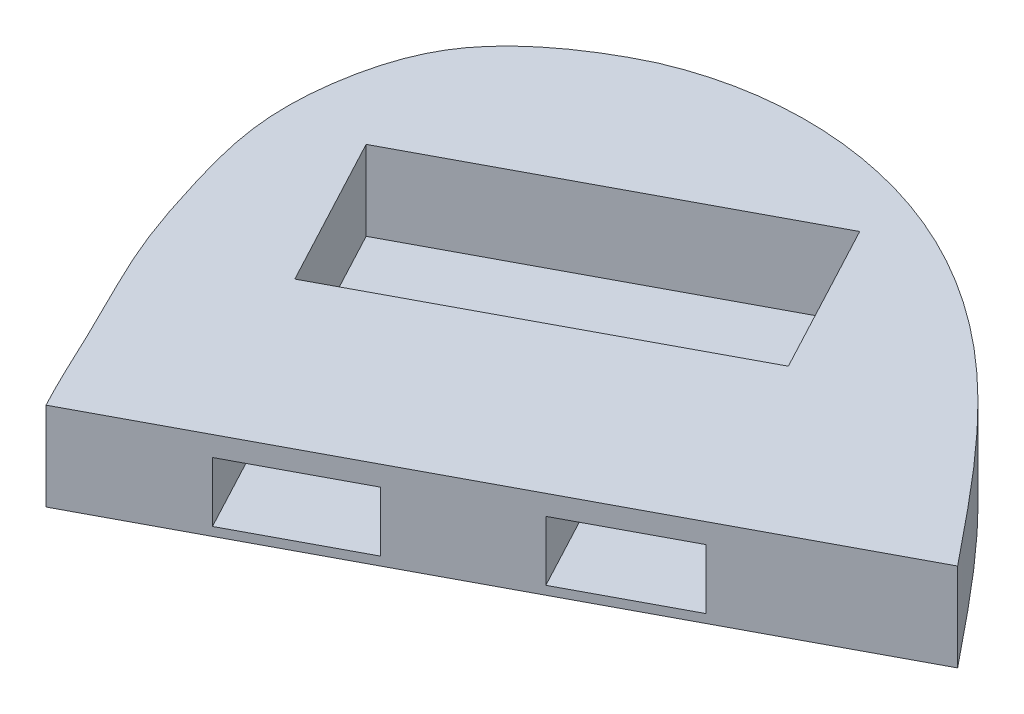
ISO-10303-21;
HEADER;
FILE_DESCRIPTION(('STEP AP214'),'2;1');
FILE_NAME('part.step','',(''),(''),'','','');
FILE_SCHEMA(('AUTOMOTIVE_DESIGN { 1 0 10303 214 1 1 1 1 }'));
ENDSEC;
DATA;
#1=APPLICATION_CONTEXT('core data for automotive mechanical design processes');
#2=APPLICATION_PROTOCOL_DEFINITION('international standard','automotive_design',2000,#1);
#3=PRODUCT_CONTEXT('',#1,'mechanical');
#4=PRODUCT('Part','Part','',(#3));
#5=PRODUCT_RELATED_PRODUCT_CATEGORY('part','',(#4));
#6=PRODUCT_DEFINITION_FORMATION('','',#4);
#7=PRODUCT_DEFINITION_CONTEXT('part definition',#1,'design');
#8=PRODUCT_DEFINITION('design','',#6,#7);
#9=PRODUCT_DEFINITION_SHAPE('','',#8);
#10=(LENGTH_UNIT() NAMED_UNIT(*) SI_UNIT(.MILLI.,.METRE.));
#11=(NAMED_UNIT(*) PLANE_ANGLE_UNIT() SI_UNIT($,.RADIAN.));
#12=(NAMED_UNIT(*) SI_UNIT($,.STERADIAN.) SOLID_ANGLE_UNIT());
#13=UNCERTAINTY_MEASURE_WITH_UNIT(LENGTH_MEASURE(1.E-05),#10,'distance_accuracy_value','');
#14=(GEOMETRIC_REPRESENTATION_CONTEXT(3) GLOBAL_UNCERTAINTY_ASSIGNED_CONTEXT((#13)) GLOBAL_UNIT_ASSIGNED_CONTEXT((#10,
#11,#12)) REPRESENTATION_CONTEXT('',''));
#15=CARTESIAN_POINT('',(0.,0.,0.));
#16=DIRECTION('',(0.,0.,1.));
#17=DIRECTION('',(1.,0.,0.));
#18=AXIS2_PLACEMENT_3D('',#15,#16,#17);
#19=CARTESIAN_POINT('',(161.96,-1.3,136.1));
#20=CARTESIAN_POINT('',(172.431616467289,-1.3,132.92366062549));
#21=CARTESIAN_POINT('',(186.600337708084,-1.3,121.715263251537));
#22=CARTESIAN_POINT('',(189.39912013615,-1.3,101.609128057562));
#23=CARTESIAN_POINT('',(188.081273673558,-1.3,88.7381643125429));
#24=CARTESIAN_POINT('',(184.88946775456,-1.3,75.87612702777));
#25=CARTESIAN_POINT('',(179.456656007756,-1.3,63.2892862222078));
#26=CARTESIAN_POINT('',(173.041480099588,-1.3,50.8418749109873));
#27=CARTESIAN_POINT('',(166.799810929657,-1.3,38.2708218209586));
#28=CARTESIAN_POINT('',(161.603657949585,-1.3,25.3960778456965));
#29=CARTESIAN_POINT('',(156.248349303257,-1.3,12.7940604652609));
#30=CARTESIAN_POINT('',(151.450238348983,-1.3,0.0963512466594107));
#31=CARTESIAN_POINT('',(147.52678179433,-1.3,-12.9146643821365));
#32=CARTESIAN_POINT('',(141.825873335453,-1.3,-25.2640208799849));
#33=CARTESIAN_POINT('',(137.370197820183,-1.3,-38.2208791740462));
#34=CARTESIAN_POINT('',(131.875071866326,-1.3,-50.7949729016655));
#35=CARTESIAN_POINT('',(126.706198444075,-1.3,-64.3167835663084));
#36=CARTESIAN_POINT('',(117.282300149337,-1.3,-76.4515785710107));
#37=CARTESIAN_POINT('',(103.420435283994,-1.3,-93.7594552532727));
#38=CARTESIAN_POINT('',(86.8423926637906,-1.3,-113.310643183046));
#39=CARTESIAN_POINT('',(58.2004956516375,-1.3,-131.153143926562));
#40=CARTESIAN_POINT('',(35.3862610002115,-1.3,-132.287626365866));
#41=CARTESIAN_POINT('',(23.0499999999999,-1.3,-127.));
#42=B_SPLINE_CURVE_WITH_KNOTS('',3,(#19,#20,#21,#22,#23,#24,#25,#26,#27,#28,#29,#30,#31,#32,#33,
#34,#35,#36,#37,#38,#39,#40,#41),.UNSPECIFIED.,.F.,.F.,(4,1,1,1,1,1,1,1,1,1,1,1,1,1,1,1,1,1,1,1,
4),(0.,0.095093521970901,0.131398847676974,0.167295759000827,0.204174645914071,
0.242856644234697,0.282808561262435,0.322537215964124,0.361360106680141,0.400063588703523,
0.438231587369451,0.476003008797342,0.514706490820723,0.552943743519897,0.591625741840523,
0.630784900558882,0.674461237731413,0.720301596717692,0.818758385380868,0.889157941201047,1.),.UNSPECIFIED.);
#43=DIRECTION('',(0.,1.,0.));
#44=VECTOR('',#43,1.);
#45=SURFACE_OF_LINEAR_EXTRUSION('',#42,#44);
#46=DIRECTION('',(0.,-1.,0.));
#47=VECTOR('',#46,1.);
#48=CARTESIAN_POINT('',(111.276939854169,12.,-83.9283732031464));
#49=LINE('',#48,#47);
#50=CARTESIAN_POINT('',(111.276939854169,12.,-83.9283732031464));
#51=VERTEX_POINT('',#50);
#52=CARTESIAN_POINT('',(111.276939854169,-1.3,-83.9283732031464));
#53=VERTEX_POINT('',#52);
#54=EDGE_CURVE('E257',#51,#53,#49,.T.);
#55=ORIENTED_EDGE('',*,*,#54,.T.);
#56=CARTESIAN_POINT('',(23.0499999999999,-1.3,-127.));
#57=VERTEX_POINT('',#56);
#58=EDGE_CURVE('E283',#53,#57,#42,.T.);
#59=ORIENTED_EDGE('',*,*,#58,.T.);
#60=DIRECTION('',(0.,1.,0.));
#61=VECTOR('',#60,1.);
#62=CARTESIAN_POINT('',(23.0499999999999,-1.3,-127.));
#63=LINE('',#62,#61);
#64=CARTESIAN_POINT('',(23.0499999999999,12.,-127.));
#65=VERTEX_POINT('',#64);
#66=EDGE_CURVE('E11',#57,#65,#63,.T.);
#67=ORIENTED_EDGE('',*,*,#66,.T.);
#68=CARTESIAN_POINT('',(161.96,12.,136.1));
#69=CARTESIAN_POINT('',(172.431616467289,12.,132.92366062549));
#70=CARTESIAN_POINT('',(186.600337708084,12.,121.715263251537));
#71=CARTESIAN_POINT('',(189.39912013615,12.,101.609128057562));
#72=CARTESIAN_POINT('',(188.081273673558,12.,88.7381643125429));
#73=CARTESIAN_POINT('',(184.88946775456,12.,75.87612702777));
#74=CARTESIAN_POINT('',(179.456656007756,12.,63.2892862222078));
#75=CARTESIAN_POINT('',(173.041480099588,12.,50.8418749109873));
#76=CARTESIAN_POINT('',(166.799810929657,12.,38.2708218209586));
#77=CARTESIAN_POINT('',(161.603657949585,12.,25.3960778456965));
#78=CARTESIAN_POINT('',(156.248349303257,12.,12.7940604652609));
#79=CARTESIAN_POINT('',(151.450238348983,12.,0.0963512466594107));
#80=CARTESIAN_POINT('',(147.52678179433,12.,-12.9146643821365));
#81=CARTESIAN_POINT('',(141.825873335453,12.,-25.2640208799849));
#82=CARTESIAN_POINT('',(137.370197820183,12.,-38.2208791740462));
#83=CARTESIAN_POINT('',(131.875071866326,12.,-50.7949729016655));
#84=CARTESIAN_POINT('',(126.706198444075,12.,-64.3167835663084));
#85=CARTESIAN_POINT('',(117.282300149337,12.,-76.4515785710107));
#86=CARTESIAN_POINT('',(103.420435283994,12.,-93.7594552532727));
#87=CARTESIAN_POINT('',(86.8423926637906,12.,-113.310643183046));
#88=CARTESIAN_POINT('',(58.2004956516375,12.,-131.153143926562));
#89=CARTESIAN_POINT('',(35.3862610002115,12.,-132.287626365866));
#90=CARTESIAN_POINT('',(23.0499999999999,12.,-127.));
#91=B_SPLINE_CURVE_WITH_KNOTS('',3,(#68,#69,#70,#71,#72,#73,#74,#75,#76,#77,#78,#79,#80,#81,#82,
#83,#84,#85,#86,#87,#88,#89,#90),.UNSPECIFIED.,.F.,.F.,(4,1,1,1,1,1,1,1,1,1,1,1,1,1,1,1,1,1,1,1,
4),(0.,0.095093521970901,0.131398847676974,0.167295759000827,0.204174645914071,
0.242856644234697,0.282808561262435,0.322537215964124,0.361360106680141,0.400063588703523,
0.438231587369451,0.476003008797342,0.514706490820723,0.552943743519897,0.591625741840523,
0.630784900558882,0.674461237731413,0.720301596717692,0.818758385380868,0.889157941201047,1.),.UNSPECIFIED.);
#92=EDGE_CURVE('E232',#51,#65,#91,.T.);
#93=ORIENTED_EDGE('',*,*,#92,.F.);
#94=EDGE_LOOP('',(#55,#59,#67,#93));
#95=FACE_BOUND('',#94,.T.);
#96=ADVANCED_FACE('F41',(#95),#45,.T.);
#97=CARTESIAN_POINT('',(23.0499999999999,-1.3,-127.));
#98=CARTESIAN_POINT('',(22.9431635762633,-1.3,-126.902857828468));
#99=CARTESIAN_POINT('',(6.62086757120866,-1.3,-120.021081895016));
#100=CARTESIAN_POINT('',(0.93108624500881,-1.3,-101.48897046444));
#101=CARTESIAN_POINT('',(0.324008085861042,-1.3,-88.7192103159989));
#102=CARTESIAN_POINT('',(3.82594963673352,-1.3,-76.0058926896927));
#103=CARTESIAN_POINT('',(8.10752215909319,-1.3,-63.1658116784858));
#104=CARTESIAN_POINT('',(14.622542207347,-1.3,-50.8573194440418));
#105=CARTESIAN_POINT('',(20.4776217353281,-1.3,-37.8047033475267));
#106=CARTESIAN_POINT('',(28.0273865457471,-1.3,-24.819252914753));
#107=CARTESIAN_POINT('',(38.054220669438,-1.3,-12.1740803632335));
#108=CARTESIAN_POINT('',(50.0870485617876,-1.3,0.413905352796121));
#109=CARTESIAN_POINT('',(63.5158751206686,-1.3,12.7149262026637));
#110=CARTESIAN_POINT('',(76.9950020252157,-1.3,24.6371097229556));
#111=CARTESIAN_POINT('',(87.7537254124703,-1.3,37.6768141146385));
#112=CARTESIAN_POINT('',(96.951336769717,-1.3,50.0663809997177));
#113=CARTESIAN_POINT('',(102.49064318237,-1.3,63.337711531044));
#114=CARTESIAN_POINT('',(106.915198332159,-1.3,76.2856654625522));
#115=CARTESIAN_POINT('',(112.188407389899,-1.3,88.8151457373196));
#116=CARTESIAN_POINT('',(116.555805717589,-1.3,101.829881851784));
#117=CARTESIAN_POINT('',(122.760488067814,-1.3,115.656378347754));
#118=CARTESIAN_POINT('',(136.343257750094,-1.3,130.188055829177));
#119=CARTESIAN_POINT('',(151.998790453451,-1.3,139.029236194937));
#120=CARTESIAN_POINT('',(161.96,-1.3,136.1));
#121=B_SPLINE_CURVE_WITH_KNOTS('',3,(#97,#98,#99,#100,#101,#102,#103,#104,#105,#106,#107,#108,
#109,#110,#111,#112,#113,#114,#115,#116,#117,#118,#119,#120),.UNSPECIFIED.,.F.,.F.,(4,1,1,1,1,1,
1,1,1,1,1,1,1,1,1,1,1,1,1,1,1,4),(0.,0.0909453488821513,0.12664197023849,0.163655192886483,
0.201591738389516,0.240816763902877,0.281850131450043,0.322917616936431,0.365825557459317,
0.412648122136861,0.463551178747464,0.51780414134582,0.571801954990976,0.620389185691441,
0.6653351168887,0.705885891764608,0.745281612490757,0.785018619503263,0.824424381322106,
0.865568121146972,0.915423296508897,1.),.UNSPECIFIED.);
#122=DIRECTION('',(0.,1.,0.));
#123=VECTOR('',#122,1.);
#124=SURFACE_OF_LINEAR_EXTRUSION('',#121,#123);
#125=CARTESIAN_POINT('',(21.5820295756437,-1.3,-36.2367434360244));
#126=VERTEX_POINT('',#125);
#127=EDGE_CURVE('E51',#57,#126,#121,.T.);
#128=ORIENTED_EDGE('',*,*,#127,.T.);
#129=DIRECTION('',(0.,-1.,0.));
#130=VECTOR('',#129,1.);
#131=CARTESIAN_POINT('',(21.5820295756437,12.,-36.2367434360244));
#132=LINE('',#131,#130);
#133=CARTESIAN_POINT('',(21.5820295756437,12.,-36.2367434360244));
#134=VERTEX_POINT('',#133);
#135=EDGE_CURVE('E273',#134,#126,#132,.T.);
#136=ORIENTED_EDGE('',*,*,#135,.F.);
#137=CARTESIAN_POINT('',(23.0499999999999,12.,-127.));
#138=CARTESIAN_POINT('',(22.9431635762633,12.,-126.902857828468));
#139=CARTESIAN_POINT('',(6.62086757120866,12.,-120.021081895016));
#140=CARTESIAN_POINT('',(0.93108624500881,12.,-101.48897046444));
#141=CARTESIAN_POINT('',(0.324008085861042,12.,-88.7192103159989));
#142=CARTESIAN_POINT('',(3.82594963673352,12.,-76.0058926896927));
#143=CARTESIAN_POINT('',(8.10752215909319,12.,-63.1658116784858));
#144=CARTESIAN_POINT('',(14.622542207347,12.,-50.8573194440418));
#145=CARTESIAN_POINT('',(20.4776217353281,12.,-37.8047033475267));
#146=CARTESIAN_POINT('',(28.0273865457471,12.,-24.819252914753));
#147=CARTESIAN_POINT('',(38.054220669438,12.,-12.1740803632335));
#148=CARTESIAN_POINT('',(50.0870485617876,12.,0.413905352796121));
#149=CARTESIAN_POINT('',(63.5158751206686,12.,12.7149262026637));
#150=CARTESIAN_POINT('',(76.9950020252157,12.,24.6371097229556));
#151=CARTESIAN_POINT('',(87.7537254124703,12.,37.6768141146385));
#152=CARTESIAN_POINT('',(96.951336769717,12.,50.0663809997177));
#153=CARTESIAN_POINT('',(102.49064318237,12.,63.337711531044));
#154=CARTESIAN_POINT('',(106.915198332159,12.,76.2856654625522));
#155=CARTESIAN_POINT('',(112.188407389899,12.,88.8151457373196));
#156=CARTESIAN_POINT('',(116.555805717589,12.,101.829881851784));
#157=CARTESIAN_POINT('',(122.760488067814,12.,115.656378347754));
#158=CARTESIAN_POINT('',(136.343257750094,12.,130.188055829177));
#159=CARTESIAN_POINT('',(151.998790453451,12.,139.029236194937));
#160=CARTESIAN_POINT('',(161.96,12.,136.1));
#161=B_SPLINE_CURVE_WITH_KNOTS('',3,(#137,#138,#139,#140,#141,#142,#143,#144,#145,#146,#147,
#148,#149,#150,#151,#152,#153,#154,#155,#156,#157,#158,#159,#160),.UNSPECIFIED.,.F.,.F.,(4,1,1,
1,1,1,1,1,1,1,1,1,1,1,1,1,1,1,1,1,1,4),(0.,0.0909453488821513,0.12664197023849,
0.163655192886483,0.201591738389516,0.240816763902877,0.281850131450043,0.322917616936431,
0.365825557459317,0.412648122136861,0.463551178747464,0.51780414134582,0.571801954990976,
0.620389185691441,0.6653351168887,0.705885891764608,0.745281612490757,0.785018619503263,
0.824424381322106,0.865568121146972,0.915423296508897,1.),.UNSPECIFIED.);
#162=EDGE_CURVE('E219',#65,#134,#161,.T.);
#163=ORIENTED_EDGE('',*,*,#162,.F.);
#164=ORIENTED_EDGE('',*,*,#66,.F.);
#165=EDGE_LOOP('',(#128,#136,#163,#164));
#166=FACE_BOUND('',#165,.T.);
#167=ADVANCED_FACE('F317',(#166),#124,.T.);
#168=CARTESIAN_POINT('',(144.030495131598,-1.3,-20.5786991562864));
#169=DIRECTION('',(0.,-1.,0.));
#170=DIRECTION('',(0.,0.,-1.));
#171=AXIS2_PLACEMENT_3D('',#168,#169,#170);
#172=PLANE('',#171);
#173=DIRECTION('',(-0.882947592858926,0.,0.469471562785893));
#174=VECTOR('',#173,1.);
#175=CARTESIAN_POINT('',(111.276939854169,-1.3,-83.9283732031464));
#176=LINE('',#175,#174);
#177=EDGE_CURVE('E149',#53,#126,#176,.T.);
#178=ORIENTED_EDGE('',*,*,#177,.T.);
#179=ORIENTED_EDGE('',*,*,#127,.F.);
#180=ORIENTED_EDGE('',*,*,#58,.F.);
#181=EDGE_LOOP('',(#178,#179,#180));
#182=FACE_BOUND('',#181,.T.);
#183=ADVANCED_FACE('F315',(#182),#172,.T.);
#184=CARTESIAN_POINT('',(-36.5544625265365,12.,-68.7489451001683));
#185=DIRECTION('',(0.469471562785889,0.,0.882947592858928));
#186=DIRECTION('',(0.882947592858928,0.,-0.46947156278589));
#187=AXIS2_PLACEMENT_3D('',#184,#185,#186);
#188=PLANE('',#187);
#189=DIRECTION('',(-0.882947592858928,0.,0.46947156278589));
#190=VECTOR('',#189,1.);
#191=CARTESIAN_POINT('',(-36.5544625265365,0.,-68.7489451001683));
#192=LINE('',#191,#190);
#193=CARTESIAN_POINT('',(60.233534311796,0.,-120.212035890731));
#194=VERTEX_POINT('',#193);
#195=CARTESIAN_POINT('',(11.671416704555,0.,-94.3910999375069));
#196=VERTEX_POINT('',#195);
#197=EDGE_CURVE('E216',#194,#196,#192,.T.);
#198=ORIENTED_EDGE('',*,*,#197,.F.);
#199=DIRECTION('',(0.,-1.,0.));
#200=VECTOR('',#199,1.);
#201=CARTESIAN_POINT('',(60.233534311796,12.,-120.212035890731));
#202=LINE('',#201,#200);
#203=CARTESIAN_POINT('',(60.233534311796,12.,-120.212035890731));
#204=VERTEX_POINT('',#203);
#205=EDGE_CURVE('E280',#204,#194,#202,.T.);
#206=ORIENTED_EDGE('',*,*,#205,.F.);
#207=DIRECTION('',(-0.882947592858928,0.,0.46947156278589));
#208=VECTOR('',#207,1.);
#209=CARTESIAN_POINT('',(-36.5544625265365,12.,-68.7489451001683));
#210=LINE('',#209,#208);
#211=CARTESIAN_POINT('',(11.671416704555,12.,-94.3910999375069));
#212=VERTEX_POINT('',#211);
#213=EDGE_CURVE('E238',#204,#212,#210,.T.);
#214=ORIENTED_EDGE('',*,*,#213,.T.);
#215=DIRECTION('',(0.,-1.,0.));
#216=VECTOR('',#215,1.);
#217=CARTESIAN_POINT('',(11.671416704555,12.,-94.3910999375069));
#218=LINE('',#217,#216);
#219=EDGE_CURVE('E269',#212,#196,#218,.T.);
#220=ORIENTED_EDGE('',*,*,#219,.T.);
#221=EDGE_LOOP('',(#198,#206,#214,#220));
#222=FACE_BOUND('',#221,.T.);
#223=ADVANCED_FACE('F336',(#222),#188,.T.);
#224=CARTESIAN_POINT('',(96.7879968383325,12.,-51.4630907905626));
#225=DIRECTION('',(-0.882947592858928,0.,0.46947156278589));
#226=DIRECTION('',(0.46947156278589,0.,0.882947592858928));
#227=AXIS2_PLACEMENT_3D('',#224,#225,#226);
#228=PLANE('',#227);
#229=DIRECTION('',(-0.46947156278589,0.,-0.882947592858928));
#230=VECTOR('',#229,1.);
#231=CARTESIAN_POINT('',(96.7879968383325,0.,-51.4630907905626));
#232=LINE('',#231,#230);
#233=CARTESIAN_POINT('',(86.5239418278059,0.,-70.7669706906301));
#234=VERTEX_POINT('',#233);
#235=EDGE_CURVE('E261',#234,#194,#232,.T.);
#236=ORIENTED_EDGE('',*,*,#235,.F.);
#237=DIRECTION('',(0.,1.,0.));
#238=VECTOR('',#237,1.);
#239=CARTESIAN_POINT('',(86.5239418278059,0.,-70.7669706906301));
#240=LINE('',#239,#238);
#241=CARTESIAN_POINT('',(86.5239418278059,9.,-70.76697069063));
#242=VERTEX_POINT('',#241);
#243=EDGE_CURVE('E67',#234,#242,#240,.T.);
#244=ORIENTED_EDGE('',*,*,#243,.T.);
#245=DIRECTION('',(0.46947156278588,0.,0.882947592858933));
#246=VECTOR('',#245,1.);
#247=CARTESIAN_POINT('',(42.0230522540179,9.,-154.46097144351));
#248=LINE('',#247,#246);
#249=CARTESIAN_POINT('',(72.4397949442291,9.,-97.2553984763987));
#250=VERTEX_POINT('',#249);
#251=EDGE_CURVE('E173',#250,#242,#248,.T.);
#252=ORIENTED_EDGE('',*,*,#251,.F.);
#253=DIRECTION('',(0.,-1.,0.));
#254=VECTOR('',#253,1.);
#255=CARTESIAN_POINT('',(72.4397949442291,12.,-97.2553984763987));
#256=LINE('',#255,#254);
#257=CARTESIAN_POINT('',(72.4397949442291,12.,-97.2553984763987));
#258=VERTEX_POINT('',#257);
#259=EDGE_CURVE('E276',#258,#250,#256,.T.);
#260=ORIENTED_EDGE('',*,*,#259,.F.);
#261=DIRECTION('',(-0.46947156278589,0.,-0.882947592858928));
#262=VECTOR('',#261,1.);
#263=CARTESIAN_POINT('',(96.7879968383325,12.,-51.4630907905626));
#264=LINE('',#263,#262);
#265=EDGE_CURVE('E245',#258,#204,#264,.T.);
#266=ORIENTED_EDGE('',*,*,#265,.T.);
#267=ORIENTED_EDGE('',*,*,#205,.T.);
#268=EDGE_LOOP('',(#236,#244,#252,#260,#266,#267));
#269=FACE_BOUND('',#268,.T.);
#270=ADVANCED_FACE('F332',(#269),#228,.T.);
#271=CARTESIAN_POINT('',(-24.3482018941034,12.,-45.7923076858362));
#272=DIRECTION('',(-0.469471562785889,0.,-0.882947592858928));
#273=DIRECTION('',(-0.882947592858928,0.,0.469471562785889));
#274=AXIS2_PLACEMENT_3D('',#271,#272,#273);
#275=PLANE('',#274);
#276=DIRECTION('',(-0.882947592858928,0.,0.469471562785889));
#277=VECTOR('',#276,1.);
#278=CARTESIAN_POINT('',(-24.3482018941023,9.,-45.7923076858368));
#279=LINE('',#278,#277);
#280=CARTESIAN_POINT('',(40.3954124725844,9.,-80.2170980844576));
#281=VERTEX_POINT('',#280);
#282=CARTESIAN_POINT('',(23.8776773369881,9.,-71.4344625231748));
#283=VERTEX_POINT('',#282);
#284=EDGE_CURVE('E138',#281,#283,#279,.T.);
#285=ORIENTED_EDGE('',*,*,#284,.T.);
#286=DIRECTION('',(0.,-1.,0.));
#287=VECTOR('',#286,1.);
#288=CARTESIAN_POINT('',(23.8776773369881,12.,-71.4344625231748));
#289=LINE('',#288,#287);
#290=CARTESIAN_POINT('',(23.8776773369881,12.,-71.4344625231748));
#291=VERTEX_POINT('',#290);
#292=EDGE_CURVE('E272',#291,#283,#289,.T.);
#293=ORIENTED_EDGE('',*,*,#292,.F.);
#294=DIRECTION('',(0.882947592858928,0.,-0.469471562785889));
#295=VECTOR('',#294,1.);
#296=CARTESIAN_POINT('',(-24.3482018941034,12.,-45.7923076858362));
#297=LINE('',#296,#295);
#298=EDGE_CURVE('E249',#291,#258,#297,.T.);
#299=ORIENTED_EDGE('',*,*,#298,.T.);
#300=ORIENTED_EDGE('',*,*,#259,.T.);
#301=DIRECTION('',(0.882947592858928,0.,-0.469471562785889));
#302=VECTOR('',#301,1.);
#303=CARTESIAN_POINT('',(-24.3482018941023,9.,-45.7923076858368));
#304=LINE('',#303,#302);
#305=CARTESIAN_POINT('',(56.678241156403,9.,-88.8748316697719));
#306=VERTEX_POINT('',#305);
#307=EDGE_CURVE('E188',#306,#250,#304,.T.);
#308=ORIENTED_EDGE('',*,*,#307,.F.);
#309=DIRECTION('',(0.,-1.,0.));
#310=VECTOR('',#309,1.);
#311=CARTESIAN_POINT('',(56.678241156403,0.,-88.8748316697719));
#312=LINE('',#311,#310);
#313=CARTESIAN_POINT('',(56.678241156403,0.,-88.8748316697719));
#314=VERTEX_POINT('',#313);
#315=EDGE_CURVE('E167',#306,#314,#312,.T.);
#316=ORIENTED_EDGE('',*,*,#315,.T.);
#317=DIRECTION('',(0.882947592858928,0.,-0.469471562785889));
#318=VECTOR('',#317,1.);
#319=CARTESIAN_POINT('',(-24.3482018941034,0.,-45.7923076858362));
#320=LINE('',#319,#318);
#321=CARTESIAN_POINT('',(40.3954124725844,0.,-80.2170980844576));
#322=VERTEX_POINT('',#321);
#323=EDGE_CURVE('E165',#322,#314,#320,.T.);
#324=ORIENTED_EDGE('',*,*,#323,.F.);
#325=DIRECTION('',(0.,-1.,0.));
#326=VECTOR('',#325,1.);
#327=CARTESIAN_POINT('',(40.3954124725844,0.,-80.2170980844575));
#328=LINE('',#327,#326);
#329=EDGE_CURVE('E155',#281,#322,#328,.T.);
#330=ORIENTED_EDGE('',*,*,#329,.F.);
#331=EDGE_LOOP('',(#285,#293,#299,#300,#308,#316,#324,#330));
#332=FACE_BOUND('',#331,.T.);
#333=ADVANCED_FACE('F162',(#332),#275,.T.);
#334=CARTESIAN_POINT('',(-10.2640550105267,12.,-19.3038799000688));
#335=DIRECTION('',(-0.469471562785879,0.,-0.882947592858933));
#336=DIRECTION('',(-0.882947592858933,0.,0.46947156278588));
#337=AXIS2_PLACEMENT_3D('',#334,#335,#336);
#338=PLANE('',#337);
#339=DIRECTION('',(0.,-1.,0.));
#340=VECTOR('',#339,1.);
#341=CARTESIAN_POINT('',(37.9618242205645,0.,-44.9460347374067));
#342=LINE('',#341,#340);
#343=CARTESIAN_POINT('',(37.9618242205645,9.,-44.9460347374067));
#344=VERTEX_POINT('',#343);
#345=CARTESIAN_POINT('',(37.9618242205645,0.,-44.9460347374067));
#346=VERTEX_POINT('',#345);
#347=EDGE_CURVE('E178',#344,#346,#342,.T.);
#348=ORIENTED_EDGE('',*,*,#347,.F.);
#349=DIRECTION('',(-0.882947592858933,0.,0.46947156278588));
#350=VECTOR('',#349,1.);
#351=CARTESIAN_POINT('',(-10.2640550105267,9.,-19.3038799000688));
#352=LINE('',#351,#350);
#353=CARTESIAN_POINT('',(54.479559356161,9.,-53.7286702986892));
#354=VERTEX_POINT('',#353);
#355=EDGE_CURVE('E171',#354,#344,#352,.T.);
#356=ORIENTED_EDGE('',*,*,#355,.F.);
#357=DIRECTION('',(0.,-1.,0.));
#358=VECTOR('',#357,1.);
#359=CARTESIAN_POINT('',(54.479559356161,0.,-53.7286702986892));
#360=LINE('',#359,#358);
#361=CARTESIAN_POINT('',(54.479559356161,0.,-53.7286702986892));
#362=VERTEX_POINT('',#361);
#363=EDGE_CURVE('E158',#354,#362,#360,.T.);
#364=ORIENTED_EDGE('',*,*,#363,.T.);
#365=DIRECTION('',(0.882947592858933,0.,-0.46947156278588));
#366=VECTOR('',#365,1.);
#367=CARTESIAN_POINT('',(-10.2640550105267,0.,-19.3038799000688));
#368=LINE('',#367,#366);
#369=EDGE_CURVE('E59',#346,#362,#368,.T.);
#370=ORIENTED_EDGE('',*,*,#369,.F.);
#371=EDGE_LOOP('',(#348,#356,#364,#370));
#372=FACE_BOUND('',#371,.T.);
#373=DIRECTION('',(0.882947592858933,0.,-0.46947156278588));
#374=VECTOR('',#373,1.);
#375=CARTESIAN_POINT('',(-10.2640550105267,0.,-19.3038799000688));
#376=LINE('',#375,#374);
#377=CARTESIAN_POINT('',(70.7623880399797,0.,-62.3864038840034));
#378=VERTEX_POINT('',#377);
#379=EDGE_CURVE('E199',#378,#234,#376,.T.);
#380=ORIENTED_EDGE('',*,*,#379,.F.);
#381=DIRECTION('',(0.,-1.,0.));
#382=VECTOR('',#381,1.);
#383=CARTESIAN_POINT('',(70.7623880399797,0.,-62.3864038840034));
#384=LINE('',#383,#382);
#385=CARTESIAN_POINT('',(70.7623880399797,9.,-62.3864038840034));
#386=VERTEX_POINT('',#385);
#387=EDGE_CURVE('E195',#386,#378,#384,.T.);
#388=ORIENTED_EDGE('',*,*,#387,.F.);
#389=DIRECTION('',(0.882947592858933,0.,-0.46947156278588));
#390=VECTOR('',#389,1.);
#391=CARTESIAN_POINT('',(-10.2640550105267,9.,-19.3038799000688));
#392=LINE('',#391,#390);
#393=EDGE_CURVE('E191',#386,#242,#392,.T.);
#394=ORIENTED_EDGE('',*,*,#393,.T.);
#395=ORIENTED_EDGE('',*,*,#243,.F.);
#396=EDGE_LOOP('',(#380,#388,#394,#395));
#397=FACE_BOUND('',#396,.T.);
#398=ORIENTED_EDGE('',*,*,#135,.T.);
#399=ORIENTED_EDGE('',*,*,#177,.F.);
#400=ORIENTED_EDGE('',*,*,#54,.F.);
#401=DIRECTION('',(0.882947592858933,0.,-0.46947156278588));
#402=VECTOR('',#401,1.);
#403=CARTESIAN_POINT('',(-10.2640550105267,12.,-19.3038799000688));
#404=LINE('',#403,#402);
#405=EDGE_CURVE('E225',#134,#51,#404,.T.);
#406=ORIENTED_EDGE('',*,*,#405,.F.);
#407=EDGE_LOOP('',(#398,#399,#400,#406));
#408=FACE_BOUND('',#407,.T.);
#409=ADVANCED_FACE('F308',(#372,#397,#408),#338,.F.);
#410=CARTESIAN_POINT('',(48.2258792310915,12.,-25.6421548373386));
#411=DIRECTION('',(0.882947592858928,0.,-0.469471562785889));
#412=DIRECTION('',(-0.469471562785889,0.,-0.882947592858928));
#413=AXIS2_PLACEMENT_3D('',#410,#411,#412);
#414=PLANE('',#413);
#415=DIRECTION('',(0.469471562785889,0.,0.882947592858928));
#416=VECTOR('',#415,1.);
#417=CARTESIAN_POINT('',(48.2258792310915,0.,-25.6421548373386));
#418=LINE('',#417,#416);
#419=EDGE_CURVE('E226',#196,#346,#418,.T.);
#420=ORIENTED_EDGE('',*,*,#419,.F.);
#421=ORIENTED_EDGE('',*,*,#219,.F.);
#422=DIRECTION('',(0.469471562785889,0.,0.882947592858928));
#423=VECTOR('',#422,1.);
#424=CARTESIAN_POINT('',(48.2258792310915,12.,-25.6421548373386));
#425=LINE('',#424,#423);
#426=EDGE_CURVE('E253',#212,#291,#425,.T.);
#427=ORIENTED_EDGE('',*,*,#426,.T.);
#428=ORIENTED_EDGE('',*,*,#292,.T.);
#429=DIRECTION('',(0.46947156278588,0.,0.882947592858933));
#430=VECTOR('',#429,1.);
#431=CARTESIAN_POINT('',(-6.53906535322345,9.,-128.640035490287));
#432=LINE('',#431,#430);
#433=EDGE_CURVE('E144',#283,#344,#432,.T.);
#434=ORIENTED_EDGE('',*,*,#433,.T.);
#435=ORIENTED_EDGE('',*,*,#347,.T.);
#436=EDGE_LOOP('',(#420,#421,#427,#428,#434,#435));
#437=FACE_BOUND('',#436,.T.);
#438=ADVANCED_FACE('F325',(#437),#414,.T.);
#439=CARTESIAN_POINT('',(0.,12.,0.));
#440=DIRECTION('',(0.,1.,0.));
#441=DIRECTION('',(0.,0.,1.));
#442=AXIS2_PLACEMENT_3D('',#439,#440,#441);
#443=PLANE('',#442);
#444=ORIENTED_EDGE('',*,*,#162,.T.);
#445=ORIENTED_EDGE('',*,*,#405,.T.);
#446=ORIENTED_EDGE('',*,*,#92,.T.);
#447=EDGE_LOOP('',(#444,#445,#446));
#448=FACE_BOUND('',#447,.T.);
#449=ORIENTED_EDGE('',*,*,#213,.F.);
#450=ORIENTED_EDGE('',*,*,#265,.F.);
#451=ORIENTED_EDGE('',*,*,#298,.F.);
#452=ORIENTED_EDGE('',*,*,#426,.F.);
#453=EDGE_LOOP('',(#449,#450,#451,#452));
#454=FACE_BOUND('',#453,.T.);
#455=ADVANCED_FACE('F321',(#448,#454),#443,.T.);
#456=CARTESIAN_POINT('',(144.030495131598,0.,-20.5786991562864));
#457=DIRECTION('',(0.,-1.,0.));
#458=DIRECTION('',(0.,0.,-1.));
#459=AXIS2_PLACEMENT_3D('',#456,#457,#458);
#460=PLANE('',#459);
#461=ORIENTED_EDGE('',*,*,#235,.T.);
#462=ORIENTED_EDGE('',*,*,#197,.T.);
#463=ORIENTED_EDGE('',*,*,#419,.T.);
#464=ORIENTED_EDGE('',*,*,#369,.T.);
#465=DIRECTION('',(0.46947156278588,0.,0.882947592858933));
#466=VECTOR('',#465,1.);
#467=CARTESIAN_POINT('',(9.978669782373,0.,-137.422671051569));
#468=LINE('',#467,#466);
#469=EDGE_CURVE('E150',#322,#362,#468,.T.);
#470=ORIENTED_EDGE('',*,*,#469,.F.);
#471=ORIENTED_EDGE('',*,*,#323,.T.);
#472=DIRECTION('',(0.46947156278588,0.,0.882947592858933));
#473=VECTOR('',#472,1.);
#474=CARTESIAN_POINT('',(26.2614984661917,0.,-146.080404636884));
#475=LINE('',#474,#473);
#476=EDGE_CURVE('E208',#314,#378,#475,.T.);
#477=ORIENTED_EDGE('',*,*,#476,.T.);
#478=ORIENTED_EDGE('',*,*,#379,.T.);
#479=EDGE_LOOP('',(#461,#462,#463,#464,#470,#471,#477,#478));
#480=FACE_BOUND('',#479,.T.);
#481=ADVANCED_FACE('F324',(#480),#460,.F.);
#482=CARTESIAN_POINT('',(26.2614984661917,0.,-146.080404636884));
#483=DIRECTION('',(-0.882947592858933,0.,0.46947156278588));
#484=DIRECTION('',(0.46947156278588,0.,0.882947592858933));
#485=AXIS2_PLACEMENT_3D('',#482,#483,#484);
#486=PLANE('',#485);
#487=DIRECTION('',(0.46947156278588,0.,0.882947592858933));
#488=VECTOR('',#487,1.);
#489=CARTESIAN_POINT('',(26.2614984661917,9.,-146.080404636884));
#490=LINE('',#489,#488);
#491=EDGE_CURVE('E205',#306,#386,#490,.T.);
#492=ORIENTED_EDGE('',*,*,#491,.T.);
#493=ORIENTED_EDGE('',*,*,#387,.T.);
#494=ORIENTED_EDGE('',*,*,#476,.F.);
#495=ORIENTED_EDGE('',*,*,#315,.F.);
#496=EDGE_LOOP('',(#492,#493,#494,#495));
#497=FACE_BOUND('',#496,.T.);
#498=ADVANCED_FACE('F345',(#497),#486,.F.);
#499=CARTESIAN_POINT('',(-54.7649445843147,9.,-102.997880652949));
#500=DIRECTION('',(0.,-1.,0.));
#501=DIRECTION('',(0.,0.,-1.));
#502=AXIS2_PLACEMENT_3D('',#499,#500,#501);
#503=PLANE('',#502);
#504=ORIENTED_EDGE('',*,*,#307,.T.);
#505=ORIENTED_EDGE('',*,*,#251,.T.);
#506=ORIENTED_EDGE('',*,*,#393,.F.);
#507=ORIENTED_EDGE('',*,*,#491,.F.);
#508=EDGE_LOOP('',(#504,#505,#506,#507));
#509=FACE_BOUND('',#508,.T.);
#510=ADVANCED_FACE('F343',(#509),#503,.T.);
#511=CARTESIAN_POINT('',(-54.7649445843147,9.,-102.997880652949));
#512=DIRECTION('',(0.,1.,0.));
#513=DIRECTION('',(0.,0.,1.));
#514=AXIS2_PLACEMENT_3D('',#511,#512,#513);
#515=PLANE('',#514);
#516=DIRECTION('',(0.46947156278588,0.,0.882947592858933));
#517=VECTOR('',#516,1.);
#518=CARTESIAN_POINT('',(9.97866978237299,9.,-137.422671051569));
#519=LINE('',#518,#517);
#520=EDGE_CURVE('E142',#281,#354,#519,.T.);
#521=ORIENTED_EDGE('',*,*,#520,.T.);
#522=ORIENTED_EDGE('',*,*,#355,.T.);
#523=ORIENTED_EDGE('',*,*,#433,.F.);
#524=ORIENTED_EDGE('',*,*,#284,.F.);
#525=EDGE_LOOP('',(#521,#522,#523,#524));
#526=FACE_BOUND('',#525,.T.);
#527=ADVANCED_FACE('F140',(#526),#515,.F.);
#528=CARTESIAN_POINT('',(9.97866978237299,0.,-137.422671051569));
#529=DIRECTION('',(-0.882947592858933,0.,0.46947156278588));
#530=DIRECTION('',(0.46947156278588,0.,0.882947592858933));
#531=AXIS2_PLACEMENT_3D('',#528,#529,#530);
#532=PLANE('',#531);
#533=ORIENTED_EDGE('',*,*,#329,.T.);
#534=ORIENTED_EDGE('',*,*,#469,.T.);
#535=ORIENTED_EDGE('',*,*,#363,.F.);
#536=ORIENTED_EDGE('',*,*,#520,.F.);
#537=EDGE_LOOP('',(#533,#534,#535,#536));
#538=FACE_BOUND('',#537,.T.);
#539=ADVANCED_FACE('F154',(#538),#532,.T.);
#540=CLOSED_SHELL('',(#96,#167,#183,#223,#270,#333,#409,#438,#455,#481,#498,#510,#527,#539));
#541=MANIFOLD_SOLID_BREP('B2',#540);
#542=ADVANCED_BREP_SHAPE_REPRESENTATION('',(#18,#541),#14);
#543=SHAPE_DEFINITION_REPRESENTATION(#9,#542);
ENDSEC;
END-ISO-10303-21;
